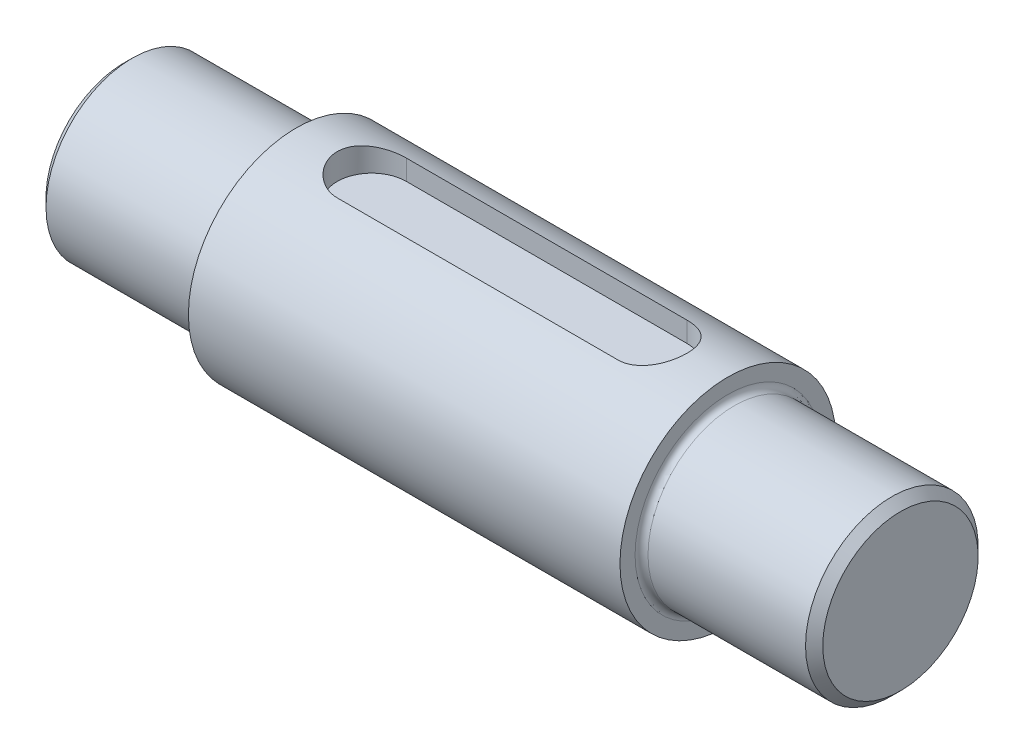
ISO-10303-21;
HEADER;
FILE_DESCRIPTION(('STEP AP214'),'2;1');
FILE_NAME('part.step','',(''),(''),'','','');
FILE_SCHEMA(('AUTOMOTIVE_DESIGN { 1 0 10303 214 1 1 1 1 }'));
ENDSEC;
DATA;
#1=APPLICATION_CONTEXT('core data for automotive mechanical design processes');
#2=APPLICATION_PROTOCOL_DEFINITION('international standard','automotive_design',2000,#1);
#3=PRODUCT_CONTEXT('',#1,'mechanical');
#4=PRODUCT('Part','Part','',(#3));
#5=PRODUCT_RELATED_PRODUCT_CATEGORY('part','',(#4));
#6=PRODUCT_DEFINITION_FORMATION('','',#4);
#7=PRODUCT_DEFINITION_CONTEXT('part definition',#1,'design');
#8=PRODUCT_DEFINITION('design','',#6,#7);
#9=PRODUCT_DEFINITION_SHAPE('','',#8);
#10=(LENGTH_UNIT() NAMED_UNIT(*) SI_UNIT(.MILLI.,.METRE.));
#11=(NAMED_UNIT(*) PLANE_ANGLE_UNIT() SI_UNIT($,.RADIAN.));
#12=(NAMED_UNIT(*) SI_UNIT($,.STERADIAN.) SOLID_ANGLE_UNIT());
#13=UNCERTAINTY_MEASURE_WITH_UNIT(LENGTH_MEASURE(1.E-05),#10,'distance_accuracy_value','');
#14=(GEOMETRIC_REPRESENTATION_CONTEXT(3) GLOBAL_UNCERTAINTY_ASSIGNED_CONTEXT((#13)) GLOBAL_UNIT_ASSIGNED_CONTEXT((#10,
#11,#12)) REPRESENTATION_CONTEXT('',''));
#15=CARTESIAN_POINT('',(0.,0.,0.));
#16=DIRECTION('',(0.,0.,1.));
#17=DIRECTION('',(1.,0.,0.));
#18=AXIS2_PLACEMENT_3D('',#15,#16,#17);
#19=CARTESIAN_POINT('',(-90.,0.,0.));
#20=DIRECTION('',(1.,0.,0.));
#21=DIRECTION('',(0.,0.,-1.));
#22=AXIS2_PLACEMENT_3D('',#19,#20,#21);
#23=PLANE('',#22);
#24=CARTESIAN_POINT('',(-90.,0.,0.));
#25=DIRECTION('',(1.,0.,0.));
#26=DIRECTION('',(0.,0.,-1.));
#27=AXIS2_PLACEMENT_3D('',#24,#25,#26);
#28=CIRCLE('',#27,18.);
#29=CARTESIAN_POINT('',(-90.,0.,-18.));
#30=VERTEX_POINT('',#29);
#31=EDGE_CURVE('E152',#30,#30,#28,.F.);
#32=ORIENTED_EDGE('',*,*,#31,.T.);
#33=EDGE_LOOP('',(#32));
#34=FACE_BOUND('',#33,.T.);
#35=ADVANCED_FACE('F41',(#34),#23,.F.);
#36=CARTESIAN_POINT('',(-90.,0.,0.));
#37=DIRECTION('',(-1.,0.,0.));
#38=DIRECTION('',(0.,0.,1.));
#39=AXIS2_PLACEMENT_3D('',#36,#37,#38);
#40=CYLINDRICAL_SURFACE('',#39,20.);
#41=CARTESIAN_POINT('',(-88.,0.,0.));
#42=DIRECTION('',(1.,0.,0.));
#43=DIRECTION('',(0.,0.,-1.));
#44=AXIS2_PLACEMENT_3D('',#41,#42,#43);
#45=CIRCLE('',#44,20.);
#46=CARTESIAN_POINT('',(-88.,0.,-20.));
#47=VERTEX_POINT('',#46);
#48=EDGE_CURVE('E156',#47,#47,#45,.T.);
#49=ORIENTED_EDGE('',*,*,#48,.T.);
#50=EDGE_LOOP('',(#49));
#51=FACE_BOUND('',#50,.T.);
#52=CARTESIAN_POINT('',(-51.5,0.,0.));
#53=DIRECTION('',(-1.,0.,0.));
#54=DIRECTION('',(0.,0.,1.));
#55=AXIS2_PLACEMENT_3D('',#52,#53,#54);
#56=CIRCLE('',#55,20.);
#57=CARTESIAN_POINT('',(-51.5,0.,20.));
#58=VERTEX_POINT('',#57);
#59=EDGE_CURVE('E140',#58,#58,#56,.T.);
#60=ORIENTED_EDGE('',*,*,#59,.T.);
#61=EDGE_LOOP('',(#60));
#62=FACE_BOUND('',#61,.T.);
#63=ADVANCED_FACE('F214',(#51,#62),#40,.T.);
#64=CARTESIAN_POINT('',(-51.5,0.,0.));
#65=DIRECTION('',(-1.,0.,0.));
#66=DIRECTION('',(0.,0.,1.));
#67=AXIS2_PLACEMENT_3D('',#64,#65,#66);
#68=TOROIDAL_SURFACE('',#67,21.5,1.5);
#69=ORIENTED_EDGE('',*,*,#59,.F.);
#70=EDGE_LOOP('',(#69));
#71=FACE_BOUND('',#70,.T.);
#72=CARTESIAN_POINT('',(-50.,0.,0.));
#73=DIRECTION('',(-1.,0.,0.));
#74=DIRECTION('',(0.,0.,1.));
#75=AXIS2_PLACEMENT_3D('',#72,#73,#74);
#76=CIRCLE('',#75,21.5);
#77=CARTESIAN_POINT('',(-50.,0.,21.5));
#78=VERTEX_POINT('',#77);
#79=EDGE_CURVE('E136',#78,#78,#76,.T.);
#80=ORIENTED_EDGE('',*,*,#79,.T.);
#81=EDGE_LOOP('',(#80));
#82=FACE_BOUND('',#81,.T.);
#83=ADVANCED_FACE('F220',(#71,#82),#68,.F.);
#84=CARTESIAN_POINT('',(-50.,0.,-21.5));
#85=DIRECTION('',(1.,0.,0.));
#86=DIRECTION('',(0.,0.,-1.));
#87=AXIS2_PLACEMENT_3D('',#84,#85,#86);
#88=PLANE('',#87);
#89=ORIENTED_EDGE('',*,*,#79,.F.);
#90=EDGE_LOOP('',(#89));
#91=FACE_BOUND('',#90,.T.);
#92=CARTESIAN_POINT('',(-50.,0.,0.));
#93=DIRECTION('',(-1.,0.,0.));
#94=DIRECTION('',(0.,0.,1.));
#95=AXIS2_PLACEMENT_3D('',#92,#93,#94);
#96=CIRCLE('',#95,25.);
#97=CARTESIAN_POINT('',(-50.,0.,25.));
#98=VERTEX_POINT('',#97);
#99=EDGE_CURVE('E132',#98,#98,#96,.T.);
#100=ORIENTED_EDGE('',*,*,#99,.T.);
#101=EDGE_LOOP('',(#100));
#102=FACE_BOUND('',#101,.T.);
#103=ADVANCED_FACE('F209',(#91,#102),#88,.F.);
#104=CARTESIAN_POINT('',(-90.,0.,0.));
#105=DIRECTION('',(-1.,0.,0.));
#106=DIRECTION('',(0.,0.,1.));
#107=AXIS2_PLACEMENT_3D('',#104,#105,#106);
#108=CYLINDRICAL_SURFACE('',#107,25.);
#109=DIRECTION('',(-1.,0.,0.));
#110=VECTOR('',#109,1.);
#111=CARTESIAN_POINT('',(-90.,23.685438564654,-8.00000000000001));
#112=LINE('',#111,#110);
#113=CARTESIAN_POINT('',(-32.5,23.685438564654,-8.00000000000001));
#114=VERTEX_POINT('',#113);
#115=CARTESIAN_POINT('',(32.5,23.685438564654,-8.00000000000001));
#116=VERTEX_POINT('',#115);
#117=EDGE_CURVE('E11',#114,#116,#112,.F.);
#118=ORIENTED_EDGE('',*,*,#117,.T.);
#119=CARTESIAN_POINT('',(32.5,23.685438564654,-8.));
#120=CARTESIAN_POINT('',(32.7187955391621,23.6854045017699,-8.0000305009868));
#121=CARTESIAN_POINT('',(32.9375784175901,23.688469123957,-7.99102549590207));
#122=CARTESIAN_POINT('',(33.3734584831461,23.7005466659397,-7.95517098834654));
#123=CARTESIAN_POINT('',(33.5905560797659,23.7095580918898,-7.92832596730078));
#124=CARTESIAN_POINT('',(34.0209180700088,23.7332474487131,-7.85711678617779));
#125=CARTESIAN_POINT('',(34.2341914372507,23.7479095676547,-7.81280150402691));
#126=CARTESIAN_POINT('',(34.656025231161,23.7824363785492,-7.70706364591999));
#127=CARTESIAN_POINT('',(34.8645855069398,23.8023012368121,-7.64564052309331));
#128=CARTESIAN_POINT('',(35.2754306308973,23.8466207436467,-7.50626477359767));
#129=CARTESIAN_POINT('',(35.4777198595615,23.871072100227,-7.42832399741401));
#130=CARTESIAN_POINT('',(35.8749573542057,23.9238701821779,-7.25648080977818));
#131=CARTESIAN_POINT('',(36.0699028602967,23.9522183537893,-7.16257246913871));
#132=CARTESIAN_POINT('',(36.4512127188176,24.0120097704205,-6.9594960920567));
#133=CARTESIAN_POINT('',(36.6375757832143,24.0434534778038,-6.85032577498935));
#134=CARTESIAN_POINT('',(37.0006602918152,24.1085882492257,-6.61744603477565));
#135=CARTESIAN_POINT('',(37.1773782438757,24.1422801175567,-6.49373139612584));
#136=CARTESIAN_POINT('',(37.5256325986393,24.2121239184413,-6.22836076648434));
#137=CARTESIAN_POINT('',(37.6968168331966,24.2483201681044,-6.08625407883805));
#138=CARTESIAN_POINT('',(38.0267130516151,24.3211568024613,-5.78833672714891));
#139=CARTESIAN_POINT('',(38.1854248130941,24.3577971950608,-5.63252581886689));
#140=CARTESIAN_POINT('',(38.4894414972978,24.4305467351509,-5.30810929270467));
#141=CARTESIAN_POINT('',(38.6347417407466,24.4666556935584,-5.13949924631991));
#142=CARTESIAN_POINT('',(38.9108811662342,24.5373508174071,-4.79062390909333));
#143=CARTESIAN_POINT('',(39.0417253747909,24.571937509624,-4.61036270425929));
#144=CARTESIAN_POINT('',(39.2911067782064,24.6394880403333,-4.23472722433445));
#145=CARTESIAN_POINT('',(39.4092679746819,24.6723920777703,-4.03909225448966));
#146=CARTESIAN_POINT('',(39.6285809303382,24.7347045975399,-3.63806855716318));
#147=CARTESIAN_POINT('',(39.7297389430682,24.764114363848,-3.43268345145265));
#148=CARTESIAN_POINT('',(39.9142534832096,24.8186095857731,-3.01351588007871));
#149=CARTESIAN_POINT('',(39.9976106399432,24.8436951942581,-2.79973371159708));
#150=CARTESIAN_POINT('',(40.1457786275789,24.8888116650216,-2.36531822354789));
#151=CARTESIAN_POINT('',(40.2105901870623,24.9088427258691,-2.14468517350128));
#152=CARTESIAN_POINT('',(40.3192705220839,24.9427025935344,-1.70544225179377));
#153=CARTESIAN_POINT('',(40.3637471662537,24.9567105519711,-1.48699651153126));
#154=CARTESIAN_POINT('',(40.4343382460007,24.9790431991589,-1.0468735142302));
#155=CARTESIAN_POINT('',(40.4604533538181,24.987368095974,-0.825196375800781));
#156=CARTESIAN_POINT('',(40.494066472453,24.9980968202581,-0.380331357109004));
#157=CARTESIAN_POINT('',(40.5015677704998,25.0005016932125,-0.157143750579824));
#158=CARTESIAN_POINT('',(40.497888417733,24.9993242896769,0.289059181581608));
#159=CARTESIAN_POINT('',(40.4867081618934,24.9957421397673,0.512074510756495));
#160=CARTESIAN_POINT('',(40.4465240781012,24.982932199242,0.948122721994506));
#161=CARTESIAN_POINT('',(40.418184152377,24.9739147546529,1.16122337440048));
#162=CARTESIAN_POINT('',(40.3445055714175,24.9506522172205,1.58424792867181));
#163=CARTESIAN_POINT('',(40.2991612547153,24.9364053833303,1.79417074826055));
#164=CARTESIAN_POINT('',(40.1918858435823,24.9030623126186,2.20926025571512));
#165=CARTESIAN_POINT('',(40.1299602872914,24.883967695069,2.4144285067935));
#166=CARTESIAN_POINT('',(39.9900005454034,24.8414102882546,2.81880991944131));
#167=CARTESIAN_POINT('',(39.9119602892948,24.8179458531793,3.01802080436252));
#168=CARTESIAN_POINT('',(39.7393438759578,24.7669380612143,3.41154318330596));
#169=CARTESIAN_POINT('',(39.6445775213702,24.7393484159813,3.60576520425746));
#170=CARTESIAN_POINT('',(39.4398473002553,24.6810018717145,3.98560999732483));
#171=CARTESIAN_POINT('',(39.3298782267942,24.6502438884484,4.1712297939689));
#172=CARTESIAN_POINT('',(39.0955258992301,24.5863428737413,4.53270747909883));
#173=CARTESIAN_POINT('',(38.971142139346,24.5531997586266,4.70856502472741));
#174=CARTESIAN_POINT('',(38.7087683555239,24.4853578278308,5.04950188641517));
#175=CARTESIAN_POINT('',(38.5707778772517,24.4506589602235,5.21458084226652));
#176=CARTESIAN_POINT('',(38.2757186660706,24.3790394135533,5.53998133884014));
#177=CARTESIAN_POINT('',(38.1180796112611,24.3420879194303,5.69977939936892));
#178=CARTESIAN_POINT('',(37.7899580506973,24.2684591422017,6.00554906117102));
#179=CARTESIAN_POINT('',(37.6194796287876,24.2317817759498,6.1515250257999));
#180=CARTESIAN_POINT('',(37.2665715934411,24.1596845061705,6.4288561789102));
#181=CARTESIAN_POINT('',(37.0841339157041,24.1242654764979,6.56020133712789));
#182=CARTESIAN_POINT('',(36.7086200944304,24.0557358007469,6.80720218507684));
#183=CARTESIAN_POINT('',(36.5155481375019,24.0226242577006,6.92286398797543));
#184=CARTESIAN_POINT('',(36.1173089688444,23.9592525423358,7.13912382113365));
#185=CARTESIAN_POINT('',(35.9120156716435,23.929035814194,7.23950267807824));
#186=CARTESIAN_POINT('',(35.4931767305922,23.8729148751205,7.42247230148352));
#187=CARTESIAN_POINT('',(35.2796345405165,23.8470088829081,7.50507041945904));
#188=CARTESIAN_POINT('',(34.8459770294644,23.8003613895494,7.65171374146479));
#189=CARTESIAN_POINT('',(34.6258690323962,23.7796143585091,7.71577882321284));
#190=CARTESIAN_POINT('',(34.1806086982161,23.7439510877628,7.82483658602115));
#191=CARTESIAN_POINT('',(33.9554587236219,23.7290321752161,7.86983801069009));
#192=CARTESIAN_POINT('',(33.5255217489757,23.7067632378289,7.93665798185135));
#193=CARTESIAN_POINT('',(33.3210652886768,23.698785219734,7.96040759697898));
#194=CARTESIAN_POINT('',(32.9110777238327,23.6881135732448,7.99207883674138));
#195=CARTESIAN_POINT('',(32.7055484834027,23.6854126941265,8.00002217927727));
#196=CARTESIAN_POINT('',(32.5,23.685438564654,8.00000000000001));
#197=B_SPLINE_CURVE_WITH_KNOTS('',3,(#119,#120,#121,#122,#123,#124,#125,#126,#127,#128,#129,
#130,#131,#132,#133,#134,#135,#136,#137,#138,#139,#140,#141,#142,#143,#144,#145,#146,#147,#148,
#149,#150,#151,#152,#153,#154,#155,#156,#157,#158,#159,#160,#161,#162,#163,#164,#165,#166,#167,
#168,#169,#170,#171,#172,#173,#174,#175,#176,#177,#178,#179,#180,#181,#182,#183,#184,#185,#186,
#187,#188,#189,#190,#191,#192,#193,#194,#195,#196),.UNSPECIFIED.,.F.,.F.,(4,2,2,2,2,2,2,2,2,2,2,
2,2,2,2,2,2,2,2,2,2,2,2,2,2,2,2,2,2,2,2,2,2,2,2,2,2,2,4),(0.,0.656160353985757,1.3121559422847,
1.96632907877124,2.6205231290108,3.27424941125305,3.92821897194339,4.58228636115632,
5.23658901442489,5.91204282760182,6.58750868128338,7.26320932101099,7.93867426802347,
8.63054127837652,9.32215326962853,10.0137408059466,10.705301168864,11.3745639939787,
12.0438023152132,12.7129224394405,13.3820284169931,14.0267677786013,14.6717219915366,
15.3164610576552,15.9614434456781,16.6142979195938,17.2673765528145,17.920478108135,
18.5736014781848,19.2552776237621,19.9367378555117,20.6186624291756,21.3003204287233,
21.9909830333727,22.6813595301152,23.3709927905347,24.0603094050434,24.6775982031613,
25.2940382559758),.UNSPECIFIED.);
#198=CARTESIAN_POINT('',(32.5,23.685438564654,8.00000000000001));
#199=VERTEX_POINT('',#198);
#200=EDGE_CURVE('E160',#116,#199,#197,.T.);
#201=ORIENTED_EDGE('',*,*,#200,.T.);
#202=DIRECTION('',(-1.,0.,0.));
#203=VECTOR('',#202,1.);
#204=CARTESIAN_POINT('',(-90.,23.685438564654,8.00000000000001));
#205=LINE('',#204,#203);
#206=CARTESIAN_POINT('',(-32.5,23.685438564654,8.));
#207=VERTEX_POINT('',#206);
#208=EDGE_CURVE('E51',#199,#207,#205,.T.);
#209=ORIENTED_EDGE('',*,*,#208,.T.);
#210=CARTESIAN_POINT('',(-32.5,23.685438564654,8.00000000000001));
#211=CARTESIAN_POINT('',(-32.7187955391621,23.6854045017699,8.00003050098682));
#212=CARTESIAN_POINT('',(-32.9375784175901,23.688469123957,7.99102549590208));
#213=CARTESIAN_POINT('',(-33.3734584831461,23.7005466659396,7.95517098834655));
#214=CARTESIAN_POINT('',(-33.5905560797659,23.7095580918898,7.92832596730079));
#215=CARTESIAN_POINT('',(-34.0209180700088,23.7332474487131,7.8571167861778));
#216=CARTESIAN_POINT('',(-34.2341914372507,23.7479095676547,7.81280150402692));
#217=CARTESIAN_POINT('',(-34.656025231161,23.7824363785492,7.70706364592));
#218=CARTESIAN_POINT('',(-34.8645855069398,23.8023012368121,7.64564052309332));
#219=CARTESIAN_POINT('',(-35.2754306308973,23.8466207436467,7.50626477359769));
#220=CARTESIAN_POINT('',(-35.4777198595615,23.8710721002269,7.42832399741402));
#221=CARTESIAN_POINT('',(-35.8749573542057,23.9238701821779,7.2564808097782));
#222=CARTESIAN_POINT('',(-36.0699028602967,23.9522183537893,7.16257246913872));
#223=CARTESIAN_POINT('',(-36.4512127188175,24.0120097704205,6.95949609205672));
#224=CARTESIAN_POINT('',(-36.6375757832142,24.0434534778038,6.85032577498937));
#225=CARTESIAN_POINT('',(-37.0006602918151,24.1085882492257,6.61744603477567));
#226=CARTESIAN_POINT('',(-37.1773782438757,24.1422801175567,6.49373139612586));
#227=CARTESIAN_POINT('',(-37.5256325986393,24.2121239184413,6.22836076648436));
#228=CARTESIAN_POINT('',(-37.6968168331966,24.2483201681044,6.08625407883806));
#229=CARTESIAN_POINT('',(-38.0267130516151,24.3211568024613,5.78833672714893));
#230=CARTESIAN_POINT('',(-38.1854248130941,24.3577971950608,5.63252581886691));
#231=CARTESIAN_POINT('',(-38.4894414972978,24.4305467351509,5.30810929270468));
#232=CARTESIAN_POINT('',(-38.6347417407466,24.4666556935584,5.13949924631992));
#233=CARTESIAN_POINT('',(-38.9108811662342,24.5373508174071,4.79062390909334));
#234=CARTESIAN_POINT('',(-39.0417253747909,24.5719375096239,4.6103627042593));
#235=CARTESIAN_POINT('',(-39.2911067782064,24.6394880403332,4.23472722433446));
#236=CARTESIAN_POINT('',(-39.4092679746819,24.6723920777703,4.03909225448967));
#237=CARTESIAN_POINT('',(-39.6285809303382,24.7347045975399,3.63806855716319));
#238=CARTESIAN_POINT('',(-39.7297389430682,24.764114363848,3.43268345145266));
#239=CARTESIAN_POINT('',(-39.9142534832096,24.8186095857731,3.01351588007872));
#240=CARTESIAN_POINT('',(-39.9976106399432,24.8436951942581,2.79973371159709));
#241=CARTESIAN_POINT('',(-40.1457786275789,24.8888116650216,2.36531822354791));
#242=CARTESIAN_POINT('',(-40.2105901870623,24.9088427258691,2.14468517350129));
#243=CARTESIAN_POINT('',(-40.3192705220839,24.9427025935344,1.70544225179378));
#244=CARTESIAN_POINT('',(-40.3637471662537,24.9567105519711,1.48699651153127));
#245=CARTESIAN_POINT('',(-40.4343382460007,24.9790431991589,1.04687351423021));
#246=CARTESIAN_POINT('',(-40.4604533538181,24.987368095974,0.825196375800791));
#247=CARTESIAN_POINT('',(-40.494066472453,24.9980968202581,0.380331357109014));
#248=CARTESIAN_POINT('',(-40.5015677704998,25.0005016932125,0.157143750579834));
#249=CARTESIAN_POINT('',(-40.497888417733,24.9993242896769,-0.289059181581599));
#250=CARTESIAN_POINT('',(-40.4867081618934,24.9957421397673,-0.512074510756486));
#251=CARTESIAN_POINT('',(-40.4465240781012,24.982932199242,-0.948122721994496));
#252=CARTESIAN_POINT('',(-40.418184152377,24.9739147546529,-1.16122337440047));
#253=CARTESIAN_POINT('',(-40.3445055714175,24.9506522172205,-1.5842479286718));
#254=CARTESIAN_POINT('',(-40.2991612547153,24.9364053833303,-1.79417074826054));
#255=CARTESIAN_POINT('',(-40.1918858435823,24.9030623126186,-2.20926025571512));
#256=CARTESIAN_POINT('',(-40.1299602872914,24.883967695069,-2.41442850679349));
#257=CARTESIAN_POINT('',(-39.9900005454034,24.8414102882546,-2.81880991944131));
#258=CARTESIAN_POINT('',(-39.9119602892948,24.8179458531793,-3.01802080436252));
#259=CARTESIAN_POINT('',(-39.7393438759578,24.7669380612143,-3.41154318330595));
#260=CARTESIAN_POINT('',(-39.6445775213702,24.7393484159813,-3.60576520425745));
#261=CARTESIAN_POINT('',(-39.4398473002553,24.6810018717145,-3.98560999732482));
#262=CARTESIAN_POINT('',(-39.3298782267942,24.6502438884484,-4.17122979396889));
#263=CARTESIAN_POINT('',(-39.0955258992301,24.5863428737413,-4.53270747909883));
#264=CARTESIAN_POINT('',(-38.971142139346,24.5531997586266,-4.7085650247274));
#265=CARTESIAN_POINT('',(-38.7087683555239,24.4853578278308,-5.04950188641516));
#266=CARTESIAN_POINT('',(-38.5707778772517,24.4506589602235,-5.21458084226651));
#267=CARTESIAN_POINT('',(-38.2757186660706,24.3790394135533,-5.53998133884013));
#268=CARTESIAN_POINT('',(-38.1180796112611,24.3420879194303,-5.69977939936891));
#269=CARTESIAN_POINT('',(-37.7899580506973,24.2684591422018,-6.00554906117101));
#270=CARTESIAN_POINT('',(-37.6194796287876,24.2317817759498,-6.15152502579989));
#271=CARTESIAN_POINT('',(-37.2665715934411,24.1596845061705,-6.42885617891019));
#272=CARTESIAN_POINT('',(-37.0841339157041,24.124265476498,-6.56020133712788));
#273=CARTESIAN_POINT('',(-36.7086200944304,24.0557358007469,-6.80720218507683));
#274=CARTESIAN_POINT('',(-36.5155481375019,24.0226242577006,-6.92286398797542));
#275=CARTESIAN_POINT('',(-36.1173089688444,23.9592525423358,-7.13912382113365));
#276=CARTESIAN_POINT('',(-35.9120156716435,23.929035814194,-7.23950267807823));
#277=CARTESIAN_POINT('',(-35.4931767305922,23.8729148751205,-7.42247230148351));
#278=CARTESIAN_POINT('',(-35.2796345405165,23.8470088829081,-7.50507041945903));
#279=CARTESIAN_POINT('',(-34.8459770294644,23.8003613895494,-7.65171374146477));
#280=CARTESIAN_POINT('',(-34.6258690323962,23.7796143585091,-7.71577882321283));
#281=CARTESIAN_POINT('',(-34.1806086982161,23.7439510877628,-7.82483658602114));
#282=CARTESIAN_POINT('',(-33.9554587236219,23.7290321752161,-7.86983801069008));
#283=CARTESIAN_POINT('',(-33.5255217489757,23.7067632378289,-7.93665798185134));
#284=CARTESIAN_POINT('',(-33.3210652886768,23.698785219734,-7.96040759697897));
#285=CARTESIAN_POINT('',(-32.9110777238327,23.6881135732448,-7.99207883674137));
#286=CARTESIAN_POINT('',(-32.7055484834027,23.6854126941265,-8.00002217927726));
#287=CARTESIAN_POINT('',(-32.5,23.685438564654,-8.));
#288=B_SPLINE_CURVE_WITH_KNOTS('',3,(#210,#211,#212,#213,#214,#215,#216,#217,#218,#219,#220,
#221,#222,#223,#224,#225,#226,#227,#228,#229,#230,#231,#232,#233,#234,#235,#236,#237,#238,#239,
#240,#241,#242,#243,#244,#245,#246,#247,#248,#249,#250,#251,#252,#253,#254,#255,#256,#257,#258,
#259,#260,#261,#262,#263,#264,#265,#266,#267,#268,#269,#270,#271,#272,#273,#274,#275,#276,#277,
#278,#279,#280,#281,#282,#283,#284,#285,#286,#287),.UNSPECIFIED.,.F.,.F.,(4,2,2,2,2,2,2,2,2,2,2,
2,2,2,2,2,2,2,2,2,2,2,2,2,2,2,2,2,2,2,2,2,2,2,2,2,2,2,4),(0.,0.656160353985757,1.3121559422847,
1.96632907877124,2.6205231290108,3.27424941125305,3.92821897194337,4.5822863611563,
5.23658901442489,5.91204282760182,6.58750868128338,7.26320932101098,7.93867426802347,
8.63054127837652,9.32215326962853,10.0137408059466,10.705301168864,11.3745639939787,
12.0438023152132,12.7129224394405,13.3820284169931,14.0267677786013,14.6717219915366,
15.3164610576552,15.9614434456781,16.6142979195938,17.2673765528145,17.920478108135,
18.5736014781848,19.2552776237621,19.9367378555117,20.6186624291756,21.3003204287234,
21.9909830333727,22.6813595301152,23.3709927905347,24.0603094050434,24.6775982031613,
25.2940382559758),.UNSPECIFIED.);
#289=EDGE_CURVE('E58',#207,#114,#288,.T.);
#290=ORIENTED_EDGE('',*,*,#289,.T.);
#291=EDGE_LOOP('',(#118,#201,#209,#290));
#292=FACE_BOUND('',#291,.T.);
#293=ORIENTED_EDGE('',*,*,#99,.F.);
#294=EDGE_LOOP('',(#293));
#295=FACE_BOUND('',#294,.T.);
#296=CARTESIAN_POINT('',(50.,0.,0.));
#297=DIRECTION('',(-1.,0.,0.));
#298=DIRECTION('',(0.,0.,1.));
#299=AXIS2_PLACEMENT_3D('',#296,#297,#298);
#300=CIRCLE('',#299,25.);
#301=CARTESIAN_POINT('',(50.,0.,24.9999999999999));
#302=VERTEX_POINT('',#301);
#303=EDGE_CURVE('E128',#302,#302,#300,.T.);
#304=ORIENTED_EDGE('',*,*,#303,.T.);
#305=EDGE_LOOP('',(#304));
#306=FACE_BOUND('',#305,.T.);
#307=ADVANCED_FACE('F175',(#292,#295,#306),#108,.T.);
#308=CARTESIAN_POINT('',(50.,0.,-21.5));
#309=DIRECTION('',(-1.,0.,0.));
#310=DIRECTION('',(0.,0.,1.));
#311=AXIS2_PLACEMENT_3D('',#308,#309,#310);
#312=PLANE('',#311);
#313=ORIENTED_EDGE('',*,*,#303,.F.);
#314=EDGE_LOOP('',(#313));
#315=FACE_BOUND('',#314,.T.);
#316=CARTESIAN_POINT('',(50.,0.,0.));
#317=DIRECTION('',(-1.,0.,0.));
#318=DIRECTION('',(0.,0.,1.));
#319=AXIS2_PLACEMENT_3D('',#316,#317,#318);
#320=CIRCLE('',#319,21.5);
#321=CARTESIAN_POINT('',(50.,0.,21.4999999999999));
#322=VERTEX_POINT('',#321);
#323=EDGE_CURVE('E124',#322,#322,#320,.T.);
#324=ORIENTED_EDGE('',*,*,#323,.T.);
#325=EDGE_LOOP('',(#324));
#326=FACE_BOUND('',#325,.T.);
#327=ADVANCED_FACE('F202',(#315,#326),#312,.F.);
#328=CARTESIAN_POINT('',(51.5,0.,0.));
#329=DIRECTION('',(-1.,0.,0.));
#330=DIRECTION('',(0.,0.,1.));
#331=AXIS2_PLACEMENT_3D('',#328,#329,#330);
#332=TOROIDAL_SURFACE('',#331,21.5,1.5);
#333=ORIENTED_EDGE('',*,*,#323,.F.);
#334=EDGE_LOOP('',(#333));
#335=FACE_BOUND('',#334,.T.);
#336=CARTESIAN_POINT('',(51.5,0.,0.));
#337=DIRECTION('',(-1.,0.,0.));
#338=DIRECTION('',(0.,0.,1.));
#339=AXIS2_PLACEMENT_3D('',#336,#337,#338);
#340=CIRCLE('',#339,20.);
#341=CARTESIAN_POINT('',(51.5,0.,19.9999999999999));
#342=VERTEX_POINT('',#341);
#343=EDGE_CURVE('E115',#342,#342,#340,.T.);
#344=ORIENTED_EDGE('',*,*,#343,.T.);
#345=EDGE_LOOP('',(#344));
#346=FACE_BOUND('',#345,.T.);
#347=ADVANCED_FACE('F199',(#335,#346),#332,.F.);
#348=CARTESIAN_POINT('',(-90.,0.,0.));
#349=DIRECTION('',(-1.,0.,0.));
#350=DIRECTION('',(0.,0.,1.));
#351=AXIS2_PLACEMENT_3D('',#348,#349,#350);
#352=CYLINDRICAL_SURFACE('',#351,20.);
#353=CARTESIAN_POINT('',(88.,0.,0.));
#354=DIRECTION('',(-1.,0.,0.));
#355=DIRECTION('',(0.,0.,1.));
#356=AXIS2_PLACEMENT_3D('',#353,#354,#355);
#357=CIRCLE('',#356,20.);
#358=CARTESIAN_POINT('',(88.,0.,19.9999999999999));
#359=VERTEX_POINT('',#358);
#360=EDGE_CURVE('E144',#359,#359,#357,.T.);
#361=ORIENTED_EDGE('',*,*,#360,.T.);
#362=EDGE_LOOP('',(#361));
#363=FACE_BOUND('',#362,.T.);
#364=ORIENTED_EDGE('',*,*,#343,.F.);
#365=EDGE_LOOP('',(#364));
#366=FACE_BOUND('',#365,.T.);
#367=ADVANCED_FACE('F195',(#363,#366),#352,.T.);
#368=CARTESIAN_POINT('',(90.,0.,0.));
#369=DIRECTION('',(-1.,0.,0.));
#370=DIRECTION('',(0.,0.,1.));
#371=AXIS2_PLACEMENT_3D('',#368,#369,#370);
#372=PLANE('',#371);
#373=CARTESIAN_POINT('',(90.,0.,0.));
#374=DIRECTION('',(-1.,0.,0.));
#375=DIRECTION('',(0.,0.,1.));
#376=AXIS2_PLACEMENT_3D('',#373,#374,#375);
#377=CIRCLE('',#376,17.9999999999999);
#378=CARTESIAN_POINT('',(90.,0.,17.9999999999999));
#379=VERTEX_POINT('',#378);
#380=EDGE_CURVE('E148',#379,#379,#377,.F.);
#381=ORIENTED_EDGE('',*,*,#380,.T.);
#382=EDGE_LOOP('',(#381));
#383=FACE_BOUND('',#382,.T.);
#384=ADVANCED_FACE('F191',(#383),#372,.F.);
#385=CARTESIAN_POINT('',(88.,0.,0.));
#386=DIRECTION('',(-1.,0.,0.));
#387=DIRECTION('',(0.,0.,1.));
#388=AXIS2_PLACEMENT_3D('',#385,#386,#387);
#389=CONICAL_SURFACE('',#388,20.,0.785398163397454);
#390=ORIENTED_EDGE('',*,*,#380,.F.);
#391=EDGE_LOOP('',(#390));
#392=FACE_BOUND('',#391,.T.);
#393=ORIENTED_EDGE('',*,*,#360,.F.);
#394=EDGE_LOOP('',(#393));
#395=FACE_BOUND('',#394,.T.);
#396=ADVANCED_FACE('F194',(#392,#395),#389,.T.);
#397=CARTESIAN_POINT('',(-90.,0.,0.));
#398=DIRECTION('',(1.,0.,0.));
#399=DIRECTION('',(0.,0.,-1.));
#400=AXIS2_PLACEMENT_3D('',#397,#398,#399);
#401=CONICAL_SURFACE('',#400,18.,0.785398163397444);
#402=ORIENTED_EDGE('',*,*,#48,.F.);
#403=EDGE_LOOP('',(#402));
#404=FACE_BOUND('',#403,.T.);
#405=ORIENTED_EDGE('',*,*,#31,.F.);
#406=EDGE_LOOP('',(#405));
#407=FACE_BOUND('',#406,.T.);
#408=ADVANCED_FACE('F44',(#404,#407),#401,.T.);
#409=CARTESIAN_POINT('',(-32.5,19.,0.));
#410=DIRECTION('',(0.,1.,0.));
#411=DIRECTION('',(0.,0.,1.));
#412=AXIS2_PLACEMENT_3D('',#409,#410,#411);
#413=CYLINDRICAL_SURFACE('',#412,8.00000000000001);
#414=DIRECTION('',(0.,1.,0.));
#415=VECTOR('',#414,1.);
#416=CARTESIAN_POINT('',(-32.5,19.,8.00000000000001));
#417=LINE('',#416,#415);
#418=CARTESIAN_POINT('',(-32.5,19.,8.00000000000001));
#419=VERTEX_POINT('',#418);
#420=EDGE_CURVE('E81',#419,#207,#417,.T.);
#421=ORIENTED_EDGE('',*,*,#420,.F.);
#422=CARTESIAN_POINT('',(-32.5,19.,0.));
#423=DIRECTION('',(0.,1.,0.));
#424=DIRECTION('',(0.,0.,1.));
#425=AXIS2_PLACEMENT_3D('',#422,#423,#424);
#426=CIRCLE('',#425,8.00000000000001);
#427=CARTESIAN_POINT('',(-32.5,19.,-8.00000000000001));
#428=VERTEX_POINT('',#427);
#429=EDGE_CURVE('E85',#428,#419,#426,.T.);
#430=ORIENTED_EDGE('',*,*,#429,.F.);
#431=DIRECTION('',(0.,1.,0.));
#432=VECTOR('',#431,1.);
#433=CARTESIAN_POINT('',(-32.5,19.,-8.00000000000001));
#434=LINE('',#433,#432);
#435=EDGE_CURVE('E112',#428,#114,#434,.T.);
#436=ORIENTED_EDGE('',*,*,#435,.T.);
#437=ORIENTED_EDGE('',*,*,#289,.F.);
#438=EDGE_LOOP('',(#421,#430,#436,#437));
#439=FACE_BOUND('',#438,.T.);
#440=ADVANCED_FACE('F83',(#439),#413,.F.);
#441=CARTESIAN_POINT('',(-32.5,19.,-8.00000000000001));
#442=DIRECTION('',(0.,0.,-1.));
#443=DIRECTION('',(-1.,0.,0.));
#444=AXIS2_PLACEMENT_3D('',#441,#442,#443);
#445=PLANE('',#444);
#446=ORIENTED_EDGE('',*,*,#435,.F.);
#447=DIRECTION('',(-1.,0.,0.));
#448=VECTOR('',#447,1.);
#449=CARTESIAN_POINT('',(-32.5,19.,-8.00000000000001));
#450=LINE('',#449,#448);
#451=CARTESIAN_POINT('',(32.5,19.,-8.00000000000001));
#452=VERTEX_POINT('',#451);
#453=EDGE_CURVE('E91',#452,#428,#450,.T.);
#454=ORIENTED_EDGE('',*,*,#453,.F.);
#455=DIRECTION('',(0.,1.,0.));
#456=VECTOR('',#455,1.);
#457=CARTESIAN_POINT('',(32.5,19.,-8.00000000000001));
#458=LINE('',#457,#456);
#459=EDGE_CURVE('E116',#452,#116,#458,.T.);
#460=ORIENTED_EDGE('',*,*,#459,.T.);
#461=ORIENTED_EDGE('',*,*,#117,.F.);
#462=EDGE_LOOP('',(#446,#454,#460,#461));
#463=FACE_BOUND('',#462,.T.);
#464=ADVANCED_FACE('F184',(#463),#445,.F.);
#465=CARTESIAN_POINT('',(32.5,19.,0.));
#466=DIRECTION('',(0.,1.,0.));
#467=DIRECTION('',(0.,0.,1.));
#468=AXIS2_PLACEMENT_3D('',#465,#466,#467);
#469=CYLINDRICAL_SURFACE('',#468,8.00000000000001);
#470=ORIENTED_EDGE('',*,*,#459,.F.);
#471=CARTESIAN_POINT('',(32.5,19.,0.));
#472=DIRECTION('',(0.,1.,0.));
#473=DIRECTION('',(0.,0.,1.));
#474=AXIS2_PLACEMENT_3D('',#471,#472,#473);
#475=CIRCLE('',#474,8.00000000000001);
#476=CARTESIAN_POINT('',(32.5,19.,8.00000000000001));
#477=VERTEX_POINT('',#476);
#478=EDGE_CURVE('E101',#477,#452,#475,.T.);
#479=ORIENTED_EDGE('',*,*,#478,.F.);
#480=DIRECTION('',(0.,1.,0.));
#481=VECTOR('',#480,1.);
#482=CARTESIAN_POINT('',(32.5,19.,8.00000000000001));
#483=LINE('',#482,#481);
#484=EDGE_CURVE('E90',#477,#199,#483,.T.);
#485=ORIENTED_EDGE('',*,*,#484,.T.);
#486=ORIENTED_EDGE('',*,*,#200,.F.);
#487=EDGE_LOOP('',(#470,#479,#485,#486));
#488=FACE_BOUND('',#487,.T.);
#489=ADVANCED_FACE('F179',(#488),#469,.F.);
#490=CARTESIAN_POINT('',(-32.5,19.,8.00000000000001));
#491=DIRECTION('',(0.,0.,1.));
#492=DIRECTION('',(1.,0.,0.));
#493=AXIS2_PLACEMENT_3D('',#490,#491,#492);
#494=PLANE('',#493);
#495=ORIENTED_EDGE('',*,*,#484,.F.);
#496=DIRECTION('',(1.,0.,0.));
#497=VECTOR('',#496,1.);
#498=CARTESIAN_POINT('',(-32.5,19.,8.00000000000001));
#499=LINE('',#498,#497);
#500=EDGE_CURVE('E94',#419,#477,#499,.T.);
#501=ORIENTED_EDGE('',*,*,#500,.F.);
#502=ORIENTED_EDGE('',*,*,#420,.T.);
#503=ORIENTED_EDGE('',*,*,#208,.F.);
#504=EDGE_LOOP('',(#495,#501,#502,#503));
#505=FACE_BOUND('',#504,.T.);
#506=ADVANCED_FACE('F95',(#505),#494,.F.);
#507=CARTESIAN_POINT('',(-32.5,19.,0.));
#508=DIRECTION('',(0.,1.,0.));
#509=DIRECTION('',(0.,0.,1.));
#510=AXIS2_PLACEMENT_3D('',#507,#508,#509);
#511=PLANE('',#510);
#512=ORIENTED_EDGE('',*,*,#429,.T.);
#513=ORIENTED_EDGE('',*,*,#500,.T.);
#514=ORIENTED_EDGE('',*,*,#478,.T.);
#515=ORIENTED_EDGE('',*,*,#453,.T.);
#516=EDGE_LOOP('',(#512,#513,#514,#515));
#517=FACE_BOUND('',#516,.T.);
#518=ADVANCED_FACE('F103',(#517),#511,.T.);
#519=CLOSED_SHELL('',(#35,#63,#83,#103,#307,#327,#347,#367,#384,#396,#408,#440,#464,#489,#506,#518));
#520=MANIFOLD_SOLID_BREP('B2',#519);
#521=ADVANCED_BREP_SHAPE_REPRESENTATION('',(#18,#520),#14);
#522=SHAPE_DEFINITION_REPRESENTATION(#9,#521);
ENDSEC;
END-ISO-10303-21;
